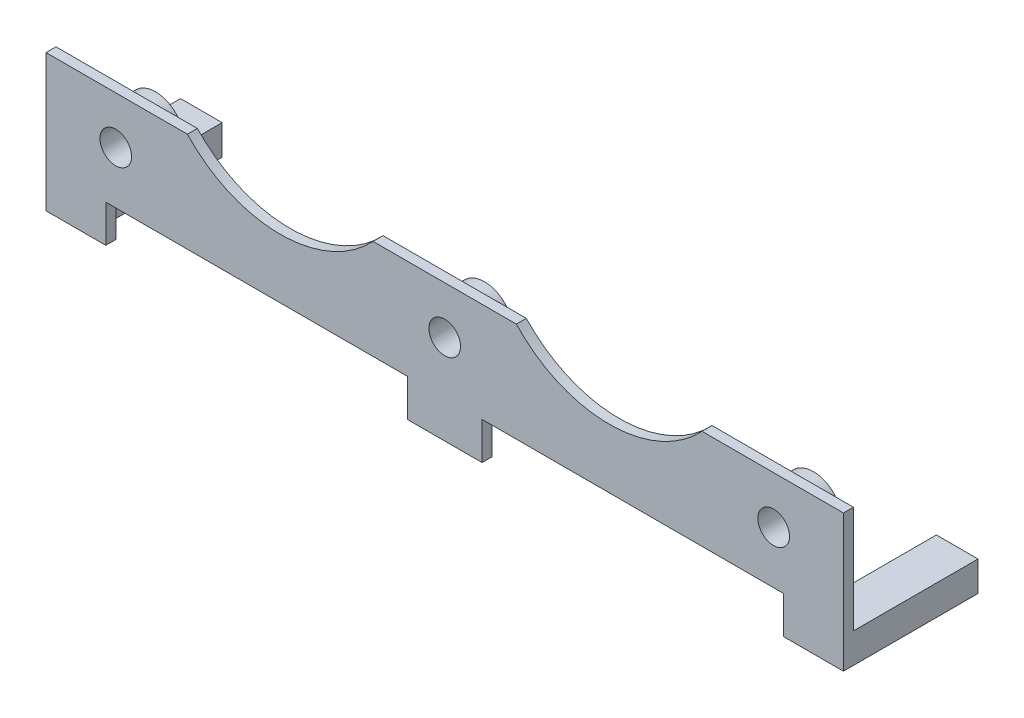
ISO-10303-21;
HEADER;
FILE_DESCRIPTION(('STEP AP214'),'2;1');
FILE_NAME('part.step','',(''),(''),'','','');
FILE_SCHEMA(('AUTOMOTIVE_DESIGN { 1 0 10303 214 1 1 1 1 }'));
ENDSEC;
DATA;
#1=APPLICATION_CONTEXT('core data for automotive mechanical design processes');
#2=APPLICATION_PROTOCOL_DEFINITION('international standard','automotive_design',2000,#1);
#3=PRODUCT_CONTEXT('',#1,'mechanical');
#4=PRODUCT('Part','Part','',(#3));
#5=PRODUCT_RELATED_PRODUCT_CATEGORY('part','',(#4));
#6=PRODUCT_DEFINITION_FORMATION('','',#4);
#7=PRODUCT_DEFINITION_CONTEXT('part definition',#1,'design');
#8=PRODUCT_DEFINITION('design','',#6,#7);
#9=PRODUCT_DEFINITION_SHAPE('','',#8);
#10=(LENGTH_UNIT() NAMED_UNIT(*) SI_UNIT(.MILLI.,.METRE.));
#11=(NAMED_UNIT(*) PLANE_ANGLE_UNIT() SI_UNIT($,.RADIAN.));
#12=(NAMED_UNIT(*) SI_UNIT($,.STERADIAN.) SOLID_ANGLE_UNIT());
#13=UNCERTAINTY_MEASURE_WITH_UNIT(LENGTH_MEASURE(1.E-05),#10,'distance_accuracy_value','');
#14=(GEOMETRIC_REPRESENTATION_CONTEXT(3) GLOBAL_UNCERTAINTY_ASSIGNED_CONTEXT((#13)) GLOBAL_UNIT_ASSIGNED_CONTEXT((#10,
#11,#12)) REPRESENTATION_CONTEXT('',''));
#15=CARTESIAN_POINT('',(0.,0.,0.));
#16=DIRECTION('',(0.,0.,1.));
#17=DIRECTION('',(1.,0.,0.));
#18=AXIS2_PLACEMENT_3D('',#15,#16,#17);
#19=CARTESIAN_POINT('',(0.,0.,0.));
#20=DIRECTION('',(0.,0.,1.));
#21=DIRECTION('',(1.,0.,0.));
#22=AXIS2_PLACEMENT_3D('',#19,#20,#21);
#23=PLANE('',#22);
#24=CARTESIAN_POINT('',(0.,-4.5,0.));
#25=DIRECTION('',(0.,0.,1.));
#26=DIRECTION('',(1.,0.,0.));
#27=AXIS2_PLACEMENT_3D('',#24,#25,#26);
#28=CIRCLE('',#27,5.675);
#29=CARTESIAN_POINT('',(5.675,-4.5,0.));
#30=VERTEX_POINT('',#29);
#31=EDGE_CURVE('E50',#30,#30,#28,.F.);
#32=ORIENTED_EDGE('',*,*,#31,.F.);
#33=EDGE_LOOP('',(#32));
#34=FACE_BOUND('',#33,.T.);
#35=CARTESIAN_POINT('',(-33.,22.4306634021703,0.));
#36=DIRECTION('',(0.,0.,-1.));
#37=DIRECTION('',(-1.,0.,0.));
#38=AXIS2_PLACEMENT_3D('',#35,#36,#37);
#39=CIRCLE('',#38,25.5106133199076);
#40=CARTESIAN_POINT('',(-51.6269526578581,4.99999999999999,0.));
#41=VERTEX_POINT('',#40);
#42=CARTESIAN_POINT('',(-14.3730473421419,4.99999999999999,0.));
#43=VERTEX_POINT('',#42);
#44=EDGE_CURVE('E189',#41,#43,#39,.F.);
#45=ORIENTED_EDGE('',*,*,#44,.T.);
#46=DIRECTION('',(1.,0.,0.));
#47=VECTOR('',#46,1.);
#48=CARTESIAN_POINT('',(0.,4.99999999999999,0.));
#49=LINE('',#48,#47);
#50=CARTESIAN_POINT('',(14.3730473421419,4.99999999999999,0.));
#51=VERTEX_POINT('',#50);
#52=EDGE_CURVE('E214',#43,#51,#49,.T.);
#53=ORIENTED_EDGE('',*,*,#52,.T.);
#54=CARTESIAN_POINT('',(33.,22.4306634021703,0.));
#55=DIRECTION('',(0.,0.,-1.));
#56=DIRECTION('',(-1.,0.,0.));
#57=AXIS2_PLACEMENT_3D('',#54,#55,#56);
#58=CIRCLE('',#57,25.5106133199076);
#59=CARTESIAN_POINT('',(51.6269526578581,4.99999999999999,0.));
#60=VERTEX_POINT('',#59);
#61=EDGE_CURVE('E385',#60,#51,#58,.T.);
#62=ORIENTED_EDGE('',*,*,#61,.F.);
#63=CARTESIAN_POINT('',(80.,4.99999999999999,0.));
#64=VERTEX_POINT('',#63);
#65=EDGE_CURVE('E216',#60,#64,#49,.T.);
#66=ORIENTED_EDGE('',*,*,#65,.T.);
#67=DIRECTION('',(0.,1.,0.));
#68=VECTOR('',#67,1.);
#69=CARTESIAN_POINT('',(80.,0.,0.));
#70=LINE('',#69,#68);
#71=CARTESIAN_POINT('',(80.,-16.5,0.));
#72=VERTEX_POINT('',#71);
#73=EDGE_CURVE('E225',#72,#64,#70,.T.);
#74=ORIENTED_EDGE('',*,*,#73,.F.);
#75=DIRECTION('',(1.,0.,0.));
#76=VECTOR('',#75,1.);
#77=CARTESIAN_POINT('',(80.,-16.5,0.));
#78=LINE('',#77,#76);
#79=CARTESIAN_POINT('',(71.65,-16.5,0.));
#80=VERTEX_POINT('',#79);
#81=EDGE_CURVE('E328',#80,#72,#78,.T.);
#82=ORIENTED_EDGE('',*,*,#81,.F.);
#83=DIRECTION('',(0.,1.,0.));
#84=VECTOR('',#83,1.);
#85=CARTESIAN_POINT('',(71.65,-22.5,0.));
#86=LINE('',#85,#84);
#87=CARTESIAN_POINT('',(71.65,-22.5,0.));
#88=VERTEX_POINT('',#87);
#89=EDGE_CURVE('E333',#88,#80,#86,.T.);
#90=ORIENTED_EDGE('',*,*,#89,.F.);
#91=DIRECTION('',(1.,0.,0.));
#92=VECTOR('',#91,1.);
#93=CARTESIAN_POINT('',(0.,-22.5,0.));
#94=LINE('',#93,#92);
#95=CARTESIAN_POINT('',(68.,-22.5,0.));
#96=VERTEX_POINT('',#95);
#97=EDGE_CURVE('E230',#96,#88,#94,.T.);
#98=ORIENTED_EDGE('',*,*,#97,.F.);
#99=DIRECTION('',(0.,-1.,0.));
#100=VECTOR('',#99,1.);
#101=CARTESIAN_POINT('',(68.,0.,0.));
#102=LINE('',#101,#100);
#103=CARTESIAN_POINT('',(68.,-15.,0.));
#104=VERTEX_POINT('',#103);
#105=EDGE_CURVE('E237',#104,#96,#102,.T.);
#106=ORIENTED_EDGE('',*,*,#105,.F.);
#107=DIRECTION('',(-1.,0.,0.));
#108=VECTOR('',#107,1.);
#109=CARTESIAN_POINT('',(0.,-15.,0.));
#110=LINE('',#109,#108);
#111=CARTESIAN_POINT('',(7.50000000000001,-15.,0.));
#112=VERTEX_POINT('',#111);
#113=EDGE_CURVE('E242',#104,#112,#110,.T.);
#114=ORIENTED_EDGE('',*,*,#113,.T.);
#115=DIRECTION('',(0.,-1.,0.));
#116=VECTOR('',#115,1.);
#117=CARTESIAN_POINT('',(7.50000000000001,0.,0.));
#118=LINE('',#117,#116);
#119=CARTESIAN_POINT('',(7.50000000000001,-22.5,0.));
#120=VERTEX_POINT('',#119);
#121=EDGE_CURVE('E243',#112,#120,#118,.T.);
#122=ORIENTED_EDGE('',*,*,#121,.T.);
#123=DIRECTION('',(1.,0.,0.));
#124=VECTOR('',#123,1.);
#125=CARTESIAN_POINT('',(0.,-22.5,0.));
#126=LINE('',#125,#124);
#127=CARTESIAN_POINT('',(-7.49999999999999,-22.5,0.));
#128=VERTEX_POINT('',#127);
#129=EDGE_CURVE('E247',#128,#120,#126,.T.);
#130=ORIENTED_EDGE('',*,*,#129,.F.);
#131=DIRECTION('',(0.,-1.,0.));
#132=VECTOR('',#131,1.);
#133=CARTESIAN_POINT('',(-7.50000000000001,0.,0.));
#134=LINE('',#133,#132);
#135=CARTESIAN_POINT('',(-7.5,-15.,0.));
#136=VERTEX_POINT('',#135);
#137=EDGE_CURVE('E251',#136,#128,#134,.T.);
#138=ORIENTED_EDGE('',*,*,#137,.F.);
#139=CARTESIAN_POINT('',(-68.,-15.,0.));
#140=VERTEX_POINT('',#139);
#141=EDGE_CURVE('E254',#136,#140,#110,.T.);
#142=ORIENTED_EDGE('',*,*,#141,.T.);
#143=DIRECTION('',(0.,-1.,0.));
#144=VECTOR('',#143,1.);
#145=CARTESIAN_POINT('',(-68.,0.,0.));
#146=LINE('',#145,#144);
#147=CARTESIAN_POINT('',(-68.,-22.5,0.));
#148=VERTEX_POINT('',#147);
#149=EDGE_CURVE('E258',#140,#148,#146,.T.);
#150=ORIENTED_EDGE('',*,*,#149,.T.);
#151=DIRECTION('',(-1.,0.,0.));
#152=VECTOR('',#151,1.);
#153=CARTESIAN_POINT('',(0.,-22.5,0.));
#154=LINE('',#153,#152);
#155=CARTESIAN_POINT('',(-71.65,-22.5,0.));
#156=VERTEX_POINT('',#155);
#157=EDGE_CURVE('E262',#148,#156,#154,.T.);
#158=ORIENTED_EDGE('',*,*,#157,.T.);
#159=DIRECTION('',(0.,-1.,0.));
#160=VECTOR('',#159,1.);
#161=CARTESIAN_POINT('',(-71.65,-22.5,0.));
#162=LINE('',#161,#160);
#163=CARTESIAN_POINT('',(-71.65,-16.5,0.));
#164=VERTEX_POINT('',#163);
#165=EDGE_CURVE('E361',#164,#156,#162,.T.);
#166=ORIENTED_EDGE('',*,*,#165,.F.);
#167=DIRECTION('',(1.,0.,0.));
#168=VECTOR('',#167,1.);
#169=CARTESIAN_POINT('',(-80.,-16.5,0.));
#170=LINE('',#169,#168);
#171=CARTESIAN_POINT('',(-79.9999999999999,-16.5,0.));
#172=VERTEX_POINT('',#171);
#173=EDGE_CURVE('E366',#172,#164,#170,.T.);
#174=ORIENTED_EDGE('',*,*,#173,.F.);
#175=DIRECTION('',(0.,1.,0.));
#176=VECTOR('',#175,1.);
#177=CARTESIAN_POINT('',(-80.,0.,0.));
#178=LINE('',#177,#176);
#179=CARTESIAN_POINT('',(-80.,4.99999999999999,0.));
#180=VERTEX_POINT('',#179);
#181=EDGE_CURVE('E210',#172,#180,#178,.T.);
#182=ORIENTED_EDGE('',*,*,#181,.T.);
#183=EDGE_CURVE('E203',#180,#41,#49,.T.);
#184=ORIENTED_EDGE('',*,*,#183,.T.);
#185=EDGE_LOOP('',(#45,#53,#62,#66,#74,#82,#90,#98,#106,#114,#122,#130,#138,#142,#150,#158,#166,
#174,#182,#184));
#186=FACE_BOUND('',#185,.T.);
#187=CARTESIAN_POINT('',(66.,-4.5,0.));
#188=DIRECTION('',(0.,0.,1.));
#189=DIRECTION('',(1.,0.,0.));
#190=AXIS2_PLACEMENT_3D('',#187,#188,#189);
#191=CIRCLE('',#190,5.675);
#192=CARTESIAN_POINT('',(71.675,-4.5,0.));
#193=VERTEX_POINT('',#192);
#194=EDGE_CURVE('E525',#193,#193,#191,.F.);
#195=ORIENTED_EDGE('',*,*,#194,.F.);
#196=EDGE_LOOP('',(#195));
#197=FACE_BOUND('',#196,.T.);
#198=CARTESIAN_POINT('',(-66.,-4.50000000000046,0.));
#199=DIRECTION('',(0.,0.,1.));
#200=DIRECTION('',(1.,0.,0.));
#201=AXIS2_PLACEMENT_3D('',#198,#199,#200);
#202=CIRCLE('',#201,5.675);
#203=CARTESIAN_POINT('',(-60.325,-4.50000000000046,0.));
#204=VERTEX_POINT('',#203);
#205=EDGE_CURVE('E11',#204,#204,#202,.F.);
#206=ORIENTED_EDGE('',*,*,#205,.F.);
#207=EDGE_LOOP('',(#206));
#208=FACE_BOUND('',#207,.T.);
#209=ADVANCED_FACE('F41',(#34,#186,#197,#208),#23,.F.);
#210=CARTESIAN_POINT('',(0.,4.99999999999999,2.));
#211=DIRECTION('',(0.,1.,0.));
#212=DIRECTION('',(0.,0.,1.));
#213=AXIS2_PLACEMENT_3D('',#210,#211,#212);
#214=PLANE('',#213);
#215=ORIENTED_EDGE('',*,*,#52,.F.);
#216=DIRECTION('',(0.,0.,-1.));
#217=VECTOR('',#216,1.);
#218=CARTESIAN_POINT('',(-14.3730473421419,4.99999999999999,32.5));
#219=LINE('',#218,#217);
#220=CARTESIAN_POINT('',(-14.3730473421419,4.99999999999999,2.));
#221=VERTEX_POINT('',#220);
#222=EDGE_CURVE('E192',#221,#43,#219,.T.);
#223=ORIENTED_EDGE('',*,*,#222,.F.);
#224=DIRECTION('',(1.,0.,0.));
#225=VECTOR('',#224,1.);
#226=CARTESIAN_POINT('',(0.,4.99999999999999,2.));
#227=LINE('',#226,#225);
#228=CARTESIAN_POINT('',(14.3730473421419,4.99999999999999,2.));
#229=VERTEX_POINT('',#228);
#230=EDGE_CURVE('E283',#221,#229,#227,.T.);
#231=ORIENTED_EDGE('',*,*,#230,.T.);
#232=DIRECTION('',(0.,0.,-1.));
#233=VECTOR('',#232,1.);
#234=CARTESIAN_POINT('',(14.3730473421419,4.99999999999999,32.5));
#235=LINE('',#234,#233);
#236=EDGE_CURVE('E57',#229,#51,#235,.T.);
#237=ORIENTED_EDGE('',*,*,#236,.T.);
#238=EDGE_LOOP('',(#215,#223,#231,#237));
#239=FACE_BOUND('',#238,.T.);
#240=ADVANCED_FACE('F435',(#239),#214,.T.);
#241=CARTESIAN_POINT('',(-80.,4.99999999999999,2.));
#242=VERTEX_POINT('',#241);
#243=CARTESIAN_POINT('',(-51.6269526578581,4.99999999999999,2.));
#244=VERTEX_POINT('',#243);
#245=EDGE_CURVE('E205',#242,#244,#227,.T.);
#246=ORIENTED_EDGE('',*,*,#245,.T.);
#247=DIRECTION('',(0.,0.,-1.));
#248=VECTOR('',#247,1.);
#249=CARTESIAN_POINT('',(-51.6269526578581,4.99999999999999,32.5));
#250=LINE('',#249,#248);
#251=EDGE_CURVE('E65',#244,#41,#250,.T.);
#252=ORIENTED_EDGE('',*,*,#251,.T.);
#253=ORIENTED_EDGE('',*,*,#183,.F.);
#254=DIRECTION('',(0.,0.,-1.));
#255=VECTOR('',#254,1.);
#256=CARTESIAN_POINT('',(-80.,4.99999999999999,2.));
#257=LINE('',#256,#255);
#258=EDGE_CURVE('E272',#242,#180,#257,.T.);
#259=ORIENTED_EDGE('',*,*,#258,.F.);
#260=EDGE_LOOP('',(#246,#252,#253,#259));
#261=FACE_BOUND('',#260,.T.);
#262=ADVANCED_FACE('F202',(#261),#214,.T.);
#263=DIRECTION('',(0.,0.,-1.));
#264=VECTOR('',#263,1.);
#265=CARTESIAN_POINT('',(51.6269526578581,4.99999999999999,32.5));
#266=LINE('',#265,#264);
#267=CARTESIAN_POINT('',(51.6269526578581,4.99999999999999,2.));
#268=VERTEX_POINT('',#267);
#269=EDGE_CURVE('E382',#268,#60,#266,.T.);
#270=ORIENTED_EDGE('',*,*,#269,.F.);
#271=CARTESIAN_POINT('',(80.,4.99999999999999,2.));
#272=VERTEX_POINT('',#271);
#273=EDGE_CURVE('E284',#268,#272,#227,.T.);
#274=ORIENTED_EDGE('',*,*,#273,.T.);
#275=DIRECTION('',(0.,0.,-1.));
#276=VECTOR('',#275,1.);
#277=CARTESIAN_POINT('',(80.,4.99999999999999,2.));
#278=LINE('',#277,#276);
#279=EDGE_CURVE('E626',#272,#64,#278,.T.);
#280=ORIENTED_EDGE('',*,*,#279,.T.);
#281=ORIENTED_EDGE('',*,*,#65,.F.);
#282=EDGE_LOOP('',(#270,#274,#280,#281));
#283=FACE_BOUND('',#282,.T.);
#284=ADVANCED_FACE('F443',(#283),#214,.T.);
#285=CARTESIAN_POINT('',(0.,0.,2.));
#286=DIRECTION('',(0.,0.,1.));
#287=DIRECTION('',(1.,0.,0.));
#288=AXIS2_PLACEMENT_3D('',#285,#286,#287);
#289=PLANE('',#288);
#290=CARTESIAN_POINT('',(-66.,-4.50000000000046,2.));
#291=DIRECTION('',(0.,0.,1.));
#292=DIRECTION('',(1.,0.,0.));
#293=AXIS2_PLACEMENT_3D('',#290,#291,#292);
#294=CIRCLE('',#293,3.175);
#295=CARTESIAN_POINT('',(-62.825,-4.50000000000046,2.));
#296=VERTEX_POINT('',#295);
#297=EDGE_CURVE('E277',#296,#296,#294,.T.);
#298=ORIENTED_EDGE('',*,*,#297,.F.);
#299=EDGE_LOOP('',(#298));
#300=FACE_BOUND('',#299,.T.);
#301=CARTESIAN_POINT('',(66.,-4.5,2.));
#302=DIRECTION('',(0.,0.,1.));
#303=DIRECTION('',(1.,0.,0.));
#304=AXIS2_PLACEMENT_3D('',#301,#302,#303);
#305=CIRCLE('',#304,3.175);
#306=CARTESIAN_POINT('',(69.175,-4.5,2.));
#307=VERTEX_POINT('',#306);
#308=EDGE_CURVE('E273',#307,#307,#305,.T.);
#309=ORIENTED_EDGE('',*,*,#308,.F.);
#310=EDGE_LOOP('',(#309));
#311=FACE_BOUND('',#310,.T.);
#312=CARTESIAN_POINT('',(0.,-4.5,2.));
#313=DIRECTION('',(0.,0.,1.));
#314=DIRECTION('',(1.,0.,0.));
#315=AXIS2_PLACEMENT_3D('',#312,#313,#314);
#316=CIRCLE('',#315,3.175);
#317=CARTESIAN_POINT('',(3.175,-4.5,2.));
#318=VERTEX_POINT('',#317);
#319=EDGE_CURVE('E268',#318,#318,#316,.T.);
#320=ORIENTED_EDGE('',*,*,#319,.F.);
#321=EDGE_LOOP('',(#320));
#322=FACE_BOUND('',#321,.T.);
#323=ORIENTED_EDGE('',*,*,#230,.F.);
#324=CARTESIAN_POINT('',(-33.,22.4306634021703,2.));
#325=DIRECTION('',(0.,0.,1.));
#326=DIRECTION('',(1.,0.,0.));
#327=AXIS2_PLACEMENT_3D('',#324,#325,#326);
#328=CIRCLE('',#327,25.5106133199076);
#329=EDGE_CURVE('E522',#221,#244,#328,.F.);
#330=ORIENTED_EDGE('',*,*,#329,.T.);
#331=ORIENTED_EDGE('',*,*,#245,.F.);
#332=DIRECTION('',(0.,1.,0.));
#333=VECTOR('',#332,1.);
#334=CARTESIAN_POINT('',(-80.,0.,2.));
#335=LINE('',#334,#333);
#336=CARTESIAN_POINT('',(-80.,-22.5,2.));
#337=VERTEX_POINT('',#336);
#338=EDGE_CURVE('E213',#337,#242,#335,.T.);
#339=ORIENTED_EDGE('',*,*,#338,.F.);
#340=DIRECTION('',(-1.,0.,0.));
#341=VECTOR('',#340,1.);
#342=CARTESIAN_POINT('',(0.,-22.5,2.));
#343=LINE('',#342,#341);
#344=CARTESIAN_POINT('',(-68.,-22.5,2.));
#345=VERTEX_POINT('',#344);
#346=EDGE_CURVE('E220',#345,#337,#343,.T.);
#347=ORIENTED_EDGE('',*,*,#346,.F.);
#348=DIRECTION('',(0.,-1.,0.));
#349=VECTOR('',#348,1.);
#350=CARTESIAN_POINT('',(-68.,0.,2.));
#351=LINE('',#350,#349);
#352=CARTESIAN_POINT('',(-68.,-15.,2.));
#353=VERTEX_POINT('',#352);
#354=EDGE_CURVE('E310',#353,#345,#351,.T.);
#355=ORIENTED_EDGE('',*,*,#354,.F.);
#356=DIRECTION('',(-1.,0.,0.));
#357=VECTOR('',#356,1.);
#358=CARTESIAN_POINT('',(0.,-15.,2.));
#359=LINE('',#358,#357);
#360=CARTESIAN_POINT('',(-7.5,-15.,2.));
#361=VERTEX_POINT('',#360);
#362=EDGE_CURVE('E306',#361,#353,#359,.T.);
#363=ORIENTED_EDGE('',*,*,#362,.F.);
#364=DIRECTION('',(0.,-1.,0.));
#365=VECTOR('',#364,1.);
#366=CARTESIAN_POINT('',(-7.50000000000001,0.,2.));
#367=LINE('',#366,#365);
#368=CARTESIAN_POINT('',(-7.49999999999999,-22.5,2.));
#369=VERTEX_POINT('',#368);
#370=EDGE_CURVE('E303',#361,#369,#367,.T.);
#371=ORIENTED_EDGE('',*,*,#370,.T.);
#372=DIRECTION('',(1.,0.,0.));
#373=VECTOR('',#372,1.);
#374=CARTESIAN_POINT('',(0.,-22.5,2.));
#375=LINE('',#374,#373);
#376=CARTESIAN_POINT('',(7.50000000000001,-22.5,2.));
#377=VERTEX_POINT('',#376);
#378=EDGE_CURVE('E300',#369,#377,#375,.T.);
#379=ORIENTED_EDGE('',*,*,#378,.T.);
#380=DIRECTION('',(0.,-1.,0.));
#381=VECTOR('',#380,1.);
#382=CARTESIAN_POINT('',(7.50000000000001,0.,2.));
#383=LINE('',#382,#381);
#384=CARTESIAN_POINT('',(7.50000000000001,-15.,2.));
#385=VERTEX_POINT('',#384);
#386=EDGE_CURVE('E296',#385,#377,#383,.T.);
#387=ORIENTED_EDGE('',*,*,#386,.F.);
#388=CARTESIAN_POINT('',(68.,-15.,2.));
#389=VERTEX_POINT('',#388);
#390=EDGE_CURVE('E295',#389,#385,#359,.T.);
#391=ORIENTED_EDGE('',*,*,#390,.F.);
#392=DIRECTION('',(0.,-1.,0.));
#393=VECTOR('',#392,1.);
#394=CARTESIAN_POINT('',(68.,0.,2.));
#395=LINE('',#394,#393);
#396=CARTESIAN_POINT('',(68.,-22.5,2.));
#397=VERTEX_POINT('',#396);
#398=EDGE_CURVE('E292',#389,#397,#395,.T.);
#399=ORIENTED_EDGE('',*,*,#398,.T.);
#400=DIRECTION('',(1.,0.,0.));
#401=VECTOR('',#400,1.);
#402=CARTESIAN_POINT('',(0.,-22.5,2.));
#403=LINE('',#402,#401);
#404=CARTESIAN_POINT('',(80.,-22.5,2.));
#405=VERTEX_POINT('',#404);
#406=EDGE_CURVE('E289',#397,#405,#403,.T.);
#407=ORIENTED_EDGE('',*,*,#406,.T.);
#408=DIRECTION('',(0.,1.,0.));
#409=VECTOR('',#408,1.);
#410=CARTESIAN_POINT('',(80.,0.,2.));
#411=LINE('',#410,#409);
#412=EDGE_CURVE('E285',#405,#272,#411,.T.);
#413=ORIENTED_EDGE('',*,*,#412,.T.);
#414=ORIENTED_EDGE('',*,*,#273,.F.);
#415=CARTESIAN_POINT('',(33.,22.4306634021703,2.));
#416=DIRECTION('',(0.,0.,1.));
#417=DIRECTION('',(1.,0.,0.));
#418=AXIS2_PLACEMENT_3D('',#415,#416,#417);
#419=CIRCLE('',#418,25.5106133199076);
#420=EDGE_CURVE('E514',#229,#268,#419,.T.);
#421=ORIENTED_EDGE('',*,*,#420,.F.);
#422=EDGE_LOOP('',(#323,#330,#331,#339,#347,#355,#363,#371,#379,#387,#391,#399,#407,#413,#414,#421));
#423=FACE_BOUND('',#422,.T.);
#424=ADVANCED_FACE('F447',(#300,#311,#322,#423),#289,.T.);
#425=CARTESIAN_POINT('',(-80.,0.,2.));
#426=DIRECTION('',(-1.,0.,0.));
#427=DIRECTION('',(0.,-1.,0.));
#428=AXIS2_PLACEMENT_3D('',#425,#426,#427);
#429=PLANE('',#428);
#430=ORIENTED_EDGE('',*,*,#181,.F.);
#431=DIRECTION('',(0.,0.,1.));
#432=VECTOR('',#431,1.);
#433=CARTESIAN_POINT('',(-80.,-16.5,-25.));
#434=LINE('',#433,#432);
#435=CARTESIAN_POINT('',(-80.,-16.5,-25.));
#436=VERTEX_POINT('',#435);
#437=EDGE_CURVE('E337',#436,#172,#434,.T.);
#438=ORIENTED_EDGE('',*,*,#437,.F.);
#439=DIRECTION('',(0.,1.,0.));
#440=VECTOR('',#439,1.);
#441=CARTESIAN_POINT('',(-80.,-22.5,-25.));
#442=LINE('',#441,#440);
#443=CARTESIAN_POINT('',(-80.,-22.5,-25.));
#444=VERTEX_POINT('',#443);
#445=EDGE_CURVE('E365',#444,#436,#442,.T.);
#446=ORIENTED_EDGE('',*,*,#445,.F.);
#447=DIRECTION('',(0.,0.,-1.));
#448=VECTOR('',#447,1.);
#449=CARTESIAN_POINT('',(-80.,-22.5,2.));
#450=LINE('',#449,#448);
#451=EDGE_CURVE('E510',#337,#444,#450,.T.);
#452=ORIENTED_EDGE('',*,*,#451,.F.);
#453=ORIENTED_EDGE('',*,*,#338,.T.);
#454=ORIENTED_EDGE('',*,*,#258,.T.);
#455=EDGE_LOOP('',(#430,#438,#446,#452,#453,#454));
#456=FACE_BOUND('',#455,.T.);
#457=ADVANCED_FACE('F43',(#456),#429,.T.);
#458=CARTESIAN_POINT('',(0.,-22.5,2.));
#459=DIRECTION('',(0.,-1.,0.));
#460=DIRECTION('',(0.,0.,-1.));
#461=AXIS2_PLACEMENT_3D('',#458,#459,#460);
#462=PLANE('',#461);
#463=ORIENTED_EDGE('',*,*,#157,.F.);
#464=DIRECTION('',(0.,0.,-1.));
#465=VECTOR('',#464,1.);
#466=CARTESIAN_POINT('',(-68.,-22.5,2.));
#467=LINE('',#466,#465);
#468=EDGE_CURVE('E500',#345,#148,#467,.T.);
#469=ORIENTED_EDGE('',*,*,#468,.F.);
#470=ORIENTED_EDGE('',*,*,#346,.T.);
#471=ORIENTED_EDGE('',*,*,#451,.T.);
#472=DIRECTION('',(-1.,0.,0.));
#473=VECTOR('',#472,1.);
#474=CARTESIAN_POINT('',(-80.,-22.5,-25.));
#475=LINE('',#474,#473);
#476=CARTESIAN_POINT('',(-71.65,-22.5,-25.));
#477=VERTEX_POINT('',#476);
#478=EDGE_CURVE('E360',#477,#444,#475,.T.);
#479=ORIENTED_EDGE('',*,*,#478,.F.);
#480=DIRECTION('',(0.,0.,1.));
#481=VECTOR('',#480,1.);
#482=CARTESIAN_POINT('',(-71.65,-22.5,-25.));
#483=LINE('',#482,#481);
#484=EDGE_CURVE('E356',#477,#156,#483,.T.);
#485=ORIENTED_EDGE('',*,*,#484,.T.);
#486=EDGE_LOOP('',(#463,#469,#470,#471,#479,#485));
#487=FACE_BOUND('',#486,.T.);
#488=ADVANCED_FACE('F491',(#487),#462,.T.);
#489=CARTESIAN_POINT('',(-68.,0.,2.));
#490=DIRECTION('',(1.,0.,0.));
#491=DIRECTION('',(0.,0.,-1.));
#492=AXIS2_PLACEMENT_3D('',#489,#490,#491);
#493=PLANE('',#492);
#494=ORIENTED_EDGE('',*,*,#149,.F.);
#495=DIRECTION('',(0.,0.,-1.));
#496=VECTOR('',#495,1.);
#497=CARTESIAN_POINT('',(-68.,-15.,2.));
#498=LINE('',#497,#496);
#499=EDGE_CURVE('E507',#353,#140,#498,.T.);
#500=ORIENTED_EDGE('',*,*,#499,.F.);
#501=ORIENTED_EDGE('',*,*,#354,.T.);
#502=ORIENTED_EDGE('',*,*,#468,.T.);
#503=EDGE_LOOP('',(#494,#500,#501,#502));
#504=FACE_BOUND('',#503,.T.);
#505=ADVANCED_FACE('F489',(#504),#493,.T.);
#506=CARTESIAN_POINT('',(0.,-15.,2.));
#507=DIRECTION('',(0.,-1.,0.));
#508=DIRECTION('',(1.,0.,0.));
#509=AXIS2_PLACEMENT_3D('',#506,#507,#508);
#510=PLANE('',#509);
#511=ORIENTED_EDGE('',*,*,#141,.F.);
#512=DIRECTION('',(0.,0.,-1.));
#513=VECTOR('',#512,1.);
#514=CARTESIAN_POINT('',(-7.5,-15.,2.));
#515=LINE('',#514,#513);
#516=EDGE_CURVE('E516',#361,#136,#515,.T.);
#517=ORIENTED_EDGE('',*,*,#516,.F.);
#518=ORIENTED_EDGE('',*,*,#362,.T.);
#519=ORIENTED_EDGE('',*,*,#499,.T.);
#520=EDGE_LOOP('',(#511,#517,#518,#519));
#521=FACE_BOUND('',#520,.T.);
#522=ADVANCED_FACE('F477',(#521),#510,.T.);
#523=CARTESIAN_POINT('',(-7.50000000000001,0.,2.));
#524=DIRECTION('',(1.,0.,0.));
#525=DIRECTION('',(0.,1.,0.));
#526=AXIS2_PLACEMENT_3D('',#523,#524,#525);
#527=PLANE('',#526);
#528=ORIENTED_EDGE('',*,*,#137,.T.);
#529=DIRECTION('',(0.,0.,-1.));
#530=VECTOR('',#529,1.);
#531=CARTESIAN_POINT('',(-7.49999999999999,-22.5,2.));
#532=LINE('',#531,#530);
#533=EDGE_CURVE('E611',#369,#128,#532,.T.);
#534=ORIENTED_EDGE('',*,*,#533,.F.);
#535=ORIENTED_EDGE('',*,*,#370,.F.);
#536=ORIENTED_EDGE('',*,*,#516,.T.);
#537=EDGE_LOOP('',(#528,#534,#535,#536));
#538=FACE_BOUND('',#537,.T.);
#539=ADVANCED_FACE('F484',(#538),#527,.F.);
#540=CARTESIAN_POINT('',(0.,-22.5,2.));
#541=DIRECTION('',(0.,1.,0.));
#542=DIRECTION('',(-1.,0.,0.));
#543=AXIS2_PLACEMENT_3D('',#540,#541,#542);
#544=PLANE('',#543);
#545=ORIENTED_EDGE('',*,*,#129,.T.);
#546=DIRECTION('',(0.,0.,-1.));
#547=VECTOR('',#546,1.);
#548=CARTESIAN_POINT('',(7.50000000000001,-22.5,2.));
#549=LINE('',#548,#547);
#550=EDGE_CURVE('E604',#377,#120,#549,.T.);
#551=ORIENTED_EDGE('',*,*,#550,.F.);
#552=ORIENTED_EDGE('',*,*,#378,.F.);
#553=ORIENTED_EDGE('',*,*,#533,.T.);
#554=EDGE_LOOP('',(#545,#551,#552,#553));
#555=FACE_BOUND('',#554,.T.);
#556=ADVANCED_FACE('F480',(#555),#544,.F.);
#557=CARTESIAN_POINT('',(7.50000000000001,0.,2.));
#558=DIRECTION('',(1.,0.,0.));
#559=DIRECTION('',(0.,1.,0.));
#560=AXIS2_PLACEMENT_3D('',#557,#558,#559);
#561=PLANE('',#560);
#562=ORIENTED_EDGE('',*,*,#121,.F.);
#563=DIRECTION('',(0.,0.,-1.));
#564=VECTOR('',#563,1.);
#565=CARTESIAN_POINT('',(7.50000000000001,-15.,2.));
#566=LINE('',#565,#564);
#567=EDGE_CURVE('E598',#385,#112,#566,.T.);
#568=ORIENTED_EDGE('',*,*,#567,.F.);
#569=ORIENTED_EDGE('',*,*,#386,.T.);
#570=ORIENTED_EDGE('',*,*,#550,.T.);
#571=EDGE_LOOP('',(#562,#568,#569,#570));
#572=FACE_BOUND('',#571,.T.);
#573=ADVANCED_FACE('F475',(#572),#561,.T.);
#574=ORIENTED_EDGE('',*,*,#113,.F.);
#575=DIRECTION('',(0.,0.,-1.));
#576=VECTOR('',#575,1.);
#577=CARTESIAN_POINT('',(68.,-15.,2.));
#578=LINE('',#577,#576);
#579=EDGE_CURVE('E596',#389,#104,#578,.T.);
#580=ORIENTED_EDGE('',*,*,#579,.F.);
#581=ORIENTED_EDGE('',*,*,#390,.T.);
#582=ORIENTED_EDGE('',*,*,#567,.T.);
#583=EDGE_LOOP('',(#574,#580,#581,#582));
#584=FACE_BOUND('',#583,.T.);
#585=ADVANCED_FACE('F471',(#584),#510,.T.);
#586=CARTESIAN_POINT('',(68.,0.,2.));
#587=DIRECTION('',(1.,0.,0.));
#588=DIRECTION('',(0.,0.,-1.));
#589=AXIS2_PLACEMENT_3D('',#586,#587,#588);
#590=PLANE('',#589);
#591=ORIENTED_EDGE('',*,*,#105,.T.);
#592=DIRECTION('',(0.,0.,-1.));
#593=VECTOR('',#592,1.);
#594=CARTESIAN_POINT('',(68.,-22.5,2.));
#595=LINE('',#594,#593);
#596=EDGE_CURVE('E591',#397,#96,#595,.T.);
#597=ORIENTED_EDGE('',*,*,#596,.F.);
#598=ORIENTED_EDGE('',*,*,#398,.F.);
#599=ORIENTED_EDGE('',*,*,#579,.T.);
#600=EDGE_LOOP('',(#591,#597,#598,#599));
#601=FACE_BOUND('',#600,.T.);
#602=ADVANCED_FACE('F467',(#601),#590,.F.);
#603=CARTESIAN_POINT('',(0.,-22.5,2.));
#604=DIRECTION('',(0.,1.,0.));
#605=DIRECTION('',(-1.,0.,0.));
#606=AXIS2_PLACEMENT_3D('',#603,#604,#605);
#607=PLANE('',#606);
#608=ORIENTED_EDGE('',*,*,#97,.T.);
#609=DIRECTION('',(0.,0.,1.));
#610=VECTOR('',#609,1.);
#611=CARTESIAN_POINT('',(71.65,-22.5,-25.));
#612=LINE('',#611,#610);
#613=CARTESIAN_POINT('',(71.65,-22.5,-25.));
#614=VERTEX_POINT('',#613);
#615=EDGE_CURVE('E267',#614,#88,#612,.T.);
#616=ORIENTED_EDGE('',*,*,#615,.F.);
#617=DIRECTION('',(-1.,0.,0.));
#618=VECTOR('',#617,1.);
#619=CARTESIAN_POINT('',(80.,-22.5,-25.));
#620=LINE('',#619,#618);
#621=CARTESIAN_POINT('',(80.,-22.5,-25.));
#622=VERTEX_POINT('',#621);
#623=EDGE_CURVE('E343',#622,#614,#620,.T.);
#624=ORIENTED_EDGE('',*,*,#623,.F.);
#625=DIRECTION('',(0.,0.,-1.));
#626=VECTOR('',#625,1.);
#627=CARTESIAN_POINT('',(80.,-22.5,2.));
#628=LINE('',#627,#626);
#629=EDGE_CURVE('E623',#405,#622,#628,.T.);
#630=ORIENTED_EDGE('',*,*,#629,.F.);
#631=ORIENTED_EDGE('',*,*,#406,.F.);
#632=ORIENTED_EDGE('',*,*,#596,.T.);
#633=EDGE_LOOP('',(#608,#616,#624,#630,#631,#632));
#634=FACE_BOUND('',#633,.T.);
#635=ADVANCED_FACE('F464',(#634),#607,.F.);
#636=CARTESIAN_POINT('',(80.,0.,2.));
#637=DIRECTION('',(-1.,0.,0.));
#638=DIRECTION('',(0.,0.,1.));
#639=AXIS2_PLACEMENT_3D('',#636,#637,#638);
#640=PLANE('',#639);
#641=ORIENTED_EDGE('',*,*,#629,.T.);
#642=DIRECTION('',(0.,-1.,0.));
#643=VECTOR('',#642,1.);
#644=CARTESIAN_POINT('',(80.,-22.5,-25.));
#645=LINE('',#644,#643);
#646=CARTESIAN_POINT('',(80.,-16.5,-25.));
#647=VERTEX_POINT('',#646);
#648=EDGE_CURVE('E332',#647,#622,#645,.T.);
#649=ORIENTED_EDGE('',*,*,#648,.F.);
#650=DIRECTION('',(0.,0.,1.));
#651=VECTOR('',#650,1.);
#652=CARTESIAN_POINT('',(80.,-16.5,-25.));
#653=LINE('',#652,#651);
#654=EDGE_CURVE('E324',#647,#72,#653,.T.);
#655=ORIENTED_EDGE('',*,*,#654,.T.);
#656=ORIENTED_EDGE('',*,*,#73,.T.);
#657=ORIENTED_EDGE('',*,*,#279,.F.);
#658=ORIENTED_EDGE('',*,*,#412,.F.);
#659=EDGE_LOOP('',(#641,#649,#655,#656,#657,#658));
#660=FACE_BOUND('',#659,.T.);
#661=ADVANCED_FACE('F457',(#660),#640,.F.);
#662=CARTESIAN_POINT('',(66.,-4.5,2.));
#663=DIRECTION('',(0.,0.,-1.));
#664=DIRECTION('',(-1.,0.,0.));
#665=AXIS2_PLACEMENT_3D('',#662,#663,#664);
#666=CYLINDRICAL_SURFACE('',#665,3.175);
#667=ORIENTED_EDGE('',*,*,#308,.T.);
#668=EDGE_LOOP('',(#667));
#669=FACE_BOUND('',#668,.T.);
#670=CARTESIAN_POINT('',(66.,-4.5,-6.));
#671=DIRECTION('',(0.,0.,-1.));
#672=DIRECTION('',(-1.,0.,0.));
#673=AXIS2_PLACEMENT_3D('',#670,#671,#672);
#674=CIRCLE('',#673,3.175);
#675=CARTESIAN_POINT('',(62.825,-4.5,-6.));
#676=VERTEX_POINT('',#675);
#677=EDGE_CURVE('E396',#676,#676,#674,.T.);
#678=ORIENTED_EDGE('',*,*,#677,.T.);
#679=EDGE_LOOP('',(#678));
#680=FACE_BOUND('',#679,.T.);
#681=ADVANCED_FACE('F454',(#669,#680),#666,.F.);
#682=CARTESIAN_POINT('',(-66.,-4.50000000000046,2.));
#683=DIRECTION('',(0.,0.,-1.));
#684=DIRECTION('',(-1.,0.,0.));
#685=AXIS2_PLACEMENT_3D('',#682,#683,#684);
#686=CYLINDRICAL_SURFACE('',#685,3.175);
#687=ORIENTED_EDGE('',*,*,#297,.T.);
#688=EDGE_LOOP('',(#687));
#689=FACE_BOUND('',#688,.T.);
#690=CARTESIAN_POINT('',(-66.,-4.50000000000046,-6.));
#691=DIRECTION('',(0.,0.,-1.));
#692=DIRECTION('',(-1.,0.,0.));
#693=AXIS2_PLACEMENT_3D('',#690,#691,#692);
#694=CIRCLE('',#693,3.175);
#695=CARTESIAN_POINT('',(-69.175,-4.50000000000046,-6.));
#696=VERTEX_POINT('',#695);
#697=EDGE_CURVE('E412',#696,#696,#694,.T.);
#698=ORIENTED_EDGE('',*,*,#697,.T.);
#699=EDGE_LOOP('',(#698));
#700=FACE_BOUND('',#699,.T.);
#701=ADVANCED_FACE('F417',(#689,#700),#686,.F.);
#702=CARTESIAN_POINT('',(0.,-4.5,2.));
#703=DIRECTION('',(0.,0.,-1.));
#704=DIRECTION('',(-1.,0.,0.));
#705=AXIS2_PLACEMENT_3D('',#702,#703,#704);
#706=CYLINDRICAL_SURFACE('',#705,3.175);
#707=ORIENTED_EDGE('',*,*,#319,.T.);
#708=EDGE_LOOP('',(#707));
#709=FACE_BOUND('',#708,.T.);
#710=CARTESIAN_POINT('',(0.,-4.5,-6.));
#711=DIRECTION('',(0.,0.,-1.));
#712=DIRECTION('',(-1.,0.,0.));
#713=AXIS2_PLACEMENT_3D('',#710,#711,#712);
#714=CIRCLE('',#713,3.175);
#715=CARTESIAN_POINT('',(-3.175,-4.5,-6.));
#716=VERTEX_POINT('',#715);
#717=EDGE_CURVE('E404',#716,#716,#714,.T.);
#718=ORIENTED_EDGE('',*,*,#717,.T.);
#719=EDGE_LOOP('',(#718));
#720=FACE_BOUND('',#719,.T.);
#721=ADVANCED_FACE('F449',(#709,#720),#706,.F.);
#722=CARTESIAN_POINT('',(71.65,-22.5,-25.));
#723=DIRECTION('',(1.,0.,0.));
#724=DIRECTION('',(0.,0.,-1.));
#725=AXIS2_PLACEMENT_3D('',#722,#723,#724);
#726=PLANE('',#725);
#727=ORIENTED_EDGE('',*,*,#89,.T.);
#728=DIRECTION('',(0.,0.,1.));
#729=VECTOR('',#728,1.);
#730=CARTESIAN_POINT('',(71.65,-16.5,-25.));
#731=LINE('',#730,#729);
#732=CARTESIAN_POINT('',(71.65,-16.5,-25.));
#733=VERTEX_POINT('',#732);
#734=EDGE_CURVE('E320',#733,#80,#731,.T.);
#735=ORIENTED_EDGE('',*,*,#734,.F.);
#736=DIRECTION('',(0.,1.,0.));
#737=VECTOR('',#736,1.);
#738=CARTESIAN_POINT('',(71.65,-22.5,-25.));
#739=LINE('',#738,#737);
#740=EDGE_CURVE('E340',#614,#733,#739,.T.);
#741=ORIENTED_EDGE('',*,*,#740,.F.);
#742=ORIENTED_EDGE('',*,*,#615,.T.);
#743=EDGE_LOOP('',(#727,#735,#741,#742));
#744=FACE_BOUND('',#743,.T.);
#745=ADVANCED_FACE('F452',(#744),#726,.F.);
#746=CARTESIAN_POINT('',(80.,-16.5,-25.));
#747=DIRECTION('',(0.,-1.,0.));
#748=DIRECTION('',(1.,0.,0.));
#749=AXIS2_PLACEMENT_3D('',#746,#747,#748);
#750=PLANE('',#749);
#751=ORIENTED_EDGE('',*,*,#81,.T.);
#752=ORIENTED_EDGE('',*,*,#654,.F.);
#753=DIRECTION('',(1.,0.,0.));
#754=VECTOR('',#753,1.);
#755=CARTESIAN_POINT('',(80.,-16.5,-25.));
#756=LINE('',#755,#754);
#757=EDGE_CURVE('E327',#733,#647,#756,.T.);
#758=ORIENTED_EDGE('',*,*,#757,.F.);
#759=ORIENTED_EDGE('',*,*,#734,.T.);
#760=EDGE_LOOP('',(#751,#752,#758,#759));
#761=FACE_BOUND('',#760,.T.);
#762=ADVANCED_FACE('F571',(#761),#750,.F.);
#763=CARTESIAN_POINT('',(0.,0.,-25.));
#764=DIRECTION('',(0.,0.,1.));
#765=DIRECTION('',(1.,0.,0.));
#766=AXIS2_PLACEMENT_3D('',#763,#764,#765);
#767=PLANE('',#766);
#768=ORIENTED_EDGE('',*,*,#648,.T.);
#769=ORIENTED_EDGE('',*,*,#623,.T.);
#770=ORIENTED_EDGE('',*,*,#740,.T.);
#771=ORIENTED_EDGE('',*,*,#757,.T.);
#772=EDGE_LOOP('',(#768,#769,#770,#771));
#773=FACE_BOUND('',#772,.T.);
#774=ADVANCED_FACE('F567',(#773),#767,.F.);
#775=CARTESIAN_POINT('',(-80.,-16.5,-25.));
#776=DIRECTION('',(0.,-1.,0.));
#777=DIRECTION('',(1.,0.,0.));
#778=AXIS2_PLACEMENT_3D('',#775,#776,#777);
#779=PLANE('',#778);
#780=ORIENTED_EDGE('',*,*,#173,.T.);
#781=DIRECTION('',(0.,0.,1.));
#782=VECTOR('',#781,1.);
#783=CARTESIAN_POINT('',(-71.65,-16.5,-25.));
#784=LINE('',#783,#782);
#785=CARTESIAN_POINT('',(-71.65,-16.5,-25.));
#786=VERTEX_POINT('',#785);
#787=EDGE_CURVE('E352',#786,#164,#784,.T.);
#788=ORIENTED_EDGE('',*,*,#787,.F.);
#789=DIRECTION('',(1.,0.,0.));
#790=VECTOR('',#789,1.);
#791=CARTESIAN_POINT('',(-80.,-16.5,-25.));
#792=LINE('',#791,#790);
#793=EDGE_CURVE('E376',#436,#786,#792,.T.);
#794=ORIENTED_EDGE('',*,*,#793,.F.);
#795=ORIENTED_EDGE('',*,*,#437,.T.);
#796=EDGE_LOOP('',(#780,#788,#794,#795));
#797=FACE_BOUND('',#796,.T.);
#798=ADVANCED_FACE('F563',(#797),#779,.F.);
#799=CARTESIAN_POINT('',(-71.65,-22.5,-25.));
#800=DIRECTION('',(-1.,0.,0.));
#801=DIRECTION('',(0.,0.,1.));
#802=AXIS2_PLACEMENT_3D('',#799,#800,#801);
#803=PLANE('',#802);
#804=ORIENTED_EDGE('',*,*,#165,.T.);
#805=ORIENTED_EDGE('',*,*,#484,.F.);
#806=DIRECTION('',(0.,-1.,0.));
#807=VECTOR('',#806,1.);
#808=CARTESIAN_POINT('',(-71.65,-22.5,-25.));
#809=LINE('',#808,#807);
#810=EDGE_CURVE('E373',#786,#477,#809,.T.);
#811=ORIENTED_EDGE('',*,*,#810,.F.);
#812=ORIENTED_EDGE('',*,*,#787,.T.);
#813=EDGE_LOOP('',(#804,#805,#811,#812));
#814=FACE_BOUND('',#813,.T.);
#815=ADVANCED_FACE('F559',(#814),#803,.F.);
#816=CARTESIAN_POINT('',(0.,0.,-25.));
#817=DIRECTION('',(0.,0.,-1.));
#818=DIRECTION('',(-1.,0.,0.));
#819=AXIS2_PLACEMENT_3D('',#816,#817,#818);
#820=PLANE('',#819);
#821=ORIENTED_EDGE('',*,*,#445,.T.);
#822=ORIENTED_EDGE('',*,*,#793,.T.);
#823=ORIENTED_EDGE('',*,*,#810,.T.);
#824=ORIENTED_EDGE('',*,*,#478,.T.);
#825=EDGE_LOOP('',(#821,#822,#823,#824));
#826=FACE_BOUND('',#825,.T.);
#827=ADVANCED_FACE('F556',(#826),#820,.T.);
#828=CARTESIAN_POINT('',(33.,22.4306634021703,32.5));
#829=DIRECTION('',(0.,0.,-1.));
#830=DIRECTION('',(-1.,0.,0.));
#831=AXIS2_PLACEMENT_3D('',#828,#829,#830);
#832=CYLINDRICAL_SURFACE('',#831,25.5106133199076);
#833=ORIENTED_EDGE('',*,*,#420,.T.);
#834=ORIENTED_EDGE('',*,*,#269,.T.);
#835=ORIENTED_EDGE('',*,*,#61,.T.);
#836=ORIENTED_EDGE('',*,*,#236,.F.);
#837=EDGE_LOOP('',(#833,#834,#835,#836));
#838=FACE_BOUND('',#837,.T.);
#839=ADVANCED_FACE('F553',(#838),#832,.F.);
#840=CARTESIAN_POINT('',(-33.,22.4306634021703,32.5));
#841=DIRECTION('',(0.,0.,-1.));
#842=DIRECTION('',(-1.,0.,0.));
#843=AXIS2_PLACEMENT_3D('',#840,#841,#842);
#844=CYLINDRICAL_SURFACE('',#843,25.5106133199076);
#845=ORIENTED_EDGE('',*,*,#222,.T.);
#846=ORIENTED_EDGE('',*,*,#44,.F.);
#847=ORIENTED_EDGE('',*,*,#251,.F.);
#848=ORIENTED_EDGE('',*,*,#329,.F.);
#849=EDGE_LOOP('',(#845,#846,#847,#848));
#850=FACE_BOUND('',#849,.T.);
#851=ADVANCED_FACE('F190',(#850),#844,.F.);
#852=CARTESIAN_POINT('',(66.,-4.5,-6.));
#853=DIRECTION('',(0.,0.,-1.));
#854=DIRECTION('',(-1.,0.,0.));
#855=AXIS2_PLACEMENT_3D('',#852,#853,#854);
#856=PLANE('',#855);
#857=CARTESIAN_POINT('',(66.,-4.5,-6.));
#858=DIRECTION('',(0.,0.,-1.));
#859=DIRECTION('',(-1.,0.,0.));
#860=AXIS2_PLACEMENT_3D('',#857,#858,#859);
#861=CIRCLE('',#860,5.675);
#862=CARTESIAN_POINT('',(60.325,-4.5,-6.));
#863=VERTEX_POINT('',#862);
#864=EDGE_CURVE('E389',#863,#863,#861,.T.);
#865=ORIENTED_EDGE('',*,*,#864,.T.);
#866=EDGE_LOOP('',(#865));
#867=FACE_BOUND('',#866,.T.);
#868=ORIENTED_EDGE('',*,*,#677,.F.);
#869=EDGE_LOOP('',(#868));
#870=FACE_BOUND('',#869,.T.);
#871=ADVANCED_FACE('F538',(#867,#870),#856,.T.);
#872=CARTESIAN_POINT('',(66.,-4.5,-6.));
#873=DIRECTION('',(0.,0.,1.));
#874=DIRECTION('',(1.,0.,0.));
#875=AXIS2_PLACEMENT_3D('',#872,#873,#874);
#876=CYLINDRICAL_SURFACE('',#875,5.675);
#877=ORIENTED_EDGE('',*,*,#864,.F.);
#878=EDGE_LOOP('',(#877));
#879=FACE_BOUND('',#878,.T.);
#880=ORIENTED_EDGE('',*,*,#194,.T.);
#881=EDGE_LOOP('',(#880));
#882=FACE_BOUND('',#881,.T.);
#883=ADVANCED_FACE('F533',(#879,#882),#876,.T.);
#884=CARTESIAN_POINT('',(0.,-4.5,-6.));
#885=DIRECTION('',(0.,0.,-1.));
#886=DIRECTION('',(-1.,0.,0.));
#887=AXIS2_PLACEMENT_3D('',#884,#885,#886);
#888=PLANE('',#887);
#889=CARTESIAN_POINT('',(0.,-4.5,-6.));
#890=DIRECTION('',(0.,0.,-1.));
#891=DIRECTION('',(-1.,0.,0.));
#892=AXIS2_PLACEMENT_3D('',#889,#890,#891);
#893=CIRCLE('',#892,5.675);
#894=CARTESIAN_POINT('',(-5.675,-4.5,-6.));
#895=VERTEX_POINT('',#894);
#896=EDGE_CURVE('E400',#895,#895,#893,.T.);
#897=ORIENTED_EDGE('',*,*,#896,.T.);
#898=EDGE_LOOP('',(#897));
#899=FACE_BOUND('',#898,.T.);
#900=ORIENTED_EDGE('',*,*,#717,.F.);
#901=EDGE_LOOP('',(#900));
#902=FACE_BOUND('',#901,.T.);
#903=ADVANCED_FACE('F431',(#899,#902),#888,.T.);
#904=CARTESIAN_POINT('',(0.,-4.5,-6.));
#905=DIRECTION('',(0.,0.,1.));
#906=DIRECTION('',(1.,0.,0.));
#907=AXIS2_PLACEMENT_3D('',#904,#905,#906);
#908=CYLINDRICAL_SURFACE('',#907,5.675);
#909=ORIENTED_EDGE('',*,*,#896,.F.);
#910=EDGE_LOOP('',(#909));
#911=FACE_BOUND('',#910,.T.);
#912=ORIENTED_EDGE('',*,*,#31,.T.);
#913=EDGE_LOOP('',(#912));
#914=FACE_BOUND('',#913,.T.);
#915=ADVANCED_FACE('F422',(#911,#914),#908,.T.);
#916=CARTESIAN_POINT('',(-66.,-4.50000000000046,-6.));
#917=DIRECTION('',(0.,0.,-1.));
#918=DIRECTION('',(-1.,0.,0.));
#919=AXIS2_PLACEMENT_3D('',#916,#917,#918);
#920=PLANE('',#919);
#921=CARTESIAN_POINT('',(-66.,-4.50000000000046,-6.));
#922=DIRECTION('',(0.,0.,-1.));
#923=DIRECTION('',(-1.,0.,0.));
#924=AXIS2_PLACEMENT_3D('',#921,#922,#923);
#925=CIRCLE('',#924,5.675);
#926=CARTESIAN_POINT('',(-71.675,-4.50000000000046,-6.));
#927=VERTEX_POINT('',#926);
#928=EDGE_CURVE('E408',#927,#927,#925,.T.);
#929=ORIENTED_EDGE('',*,*,#928,.T.);
#930=EDGE_LOOP('',(#929));
#931=FACE_BOUND('',#930,.T.);
#932=ORIENTED_EDGE('',*,*,#697,.F.);
#933=EDGE_LOOP('',(#932));
#934=FACE_BOUND('',#933,.T.);
#935=ADVANCED_FACE('F419',(#931,#934),#920,.T.);
#936=CARTESIAN_POINT('',(-66.,-4.50000000000046,-6.));
#937=DIRECTION('',(0.,0.,1.));
#938=DIRECTION('',(1.,0.,0.));
#939=AXIS2_PLACEMENT_3D('',#936,#937,#938);
#940=CYLINDRICAL_SURFACE('',#939,5.675);
#941=ORIENTED_EDGE('',*,*,#928,.F.);
#942=EDGE_LOOP('',(#941));
#943=FACE_BOUND('',#942,.T.);
#944=ORIENTED_EDGE('',*,*,#205,.T.);
#945=EDGE_LOOP('',(#944));
#946=FACE_BOUND('',#945,.T.);
#947=ADVANCED_FACE('F421',(#943,#946),#940,.T.);
#948=CLOSED_SHELL('',(#209,#240,#262,#284,#424,#457,#488,#505,#522,#539,#556,#573,#585,#602,
#635,#661,#681,#701,#721,#745,#762,#774,#798,#815,#827,#839,#851,#871,#883,#903,#915,#935,#947));
#949=MANIFOLD_SOLID_BREP('B2',#948);
#950=ADVANCED_BREP_SHAPE_REPRESENTATION('',(#18,#949),#14);
#951=SHAPE_DEFINITION_REPRESENTATION(#9,#950);
ENDSEC;
END-ISO-10303-21;
